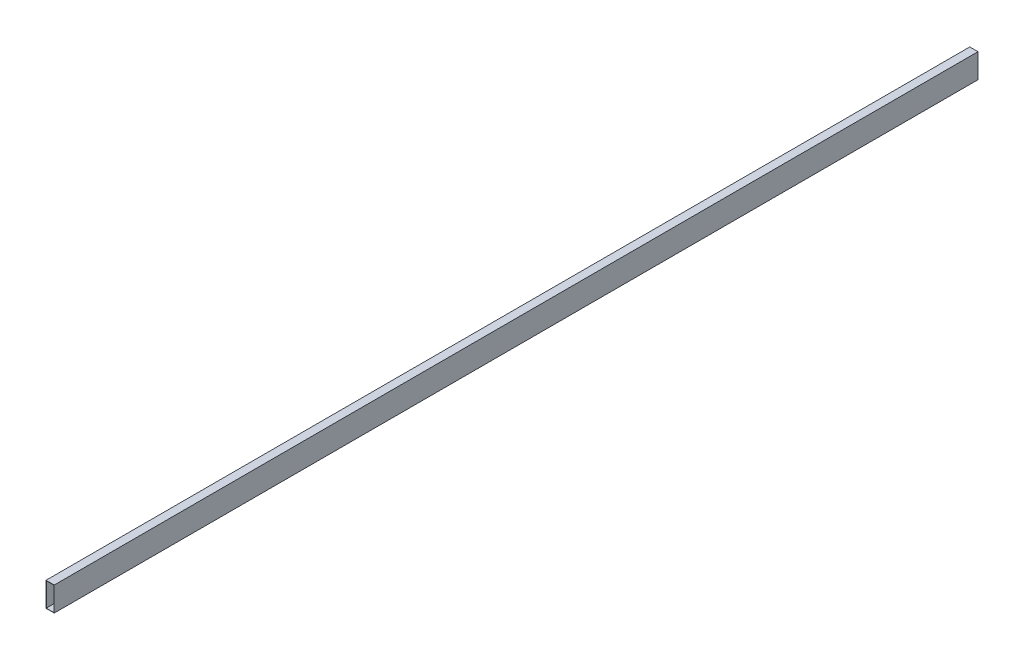
ISO-10303-21;
HEADER;
FILE_DESCRIPTION(('STEP AP214'),'2;1');
FILE_NAME('part.step','',(''),(''),'','','');
FILE_SCHEMA(('AUTOMOTIVE_DESIGN { 1 0 10303 214 1 1 1 1 }'));
ENDSEC;
DATA;
#1=APPLICATION_CONTEXT('core data for automotive mechanical design processes');
#2=APPLICATION_PROTOCOL_DEFINITION('international standard','automotive_design',2000,#1);
#3=PRODUCT_CONTEXT('',#1,'mechanical');
#4=PRODUCT('Part','Part','',(#3));
#5=PRODUCT_RELATED_PRODUCT_CATEGORY('part','',(#4));
#6=PRODUCT_DEFINITION_FORMATION('','',#4);
#7=PRODUCT_DEFINITION_CONTEXT('part definition',#1,'design');
#8=PRODUCT_DEFINITION('design','',#6,#7);
#9=PRODUCT_DEFINITION_SHAPE('','',#8);
#10=(LENGTH_UNIT() NAMED_UNIT(*) SI_UNIT(.MILLI.,.METRE.));
#11=(NAMED_UNIT(*) PLANE_ANGLE_UNIT() SI_UNIT($,.RADIAN.));
#12=(NAMED_UNIT(*) SI_UNIT($,.STERADIAN.) SOLID_ANGLE_UNIT());
#13=UNCERTAINTY_MEASURE_WITH_UNIT(LENGTH_MEASURE(1.E-05),#10,'distance_accuracy_value','');
#14=(GEOMETRIC_REPRESENTATION_CONTEXT(3) GLOBAL_UNCERTAINTY_ASSIGNED_CONTEXT((#13)) GLOBAL_UNIT_ASSIGNED_CONTEXT((#10,
#11,#12)) REPRESENTATION_CONTEXT('',''));
#15=CARTESIAN_POINT('',(0.,0.,0.));
#16=DIRECTION('',(0.,0.,1.));
#17=DIRECTION('',(1.,0.,0.));
#18=AXIS2_PLACEMENT_3D('',#15,#16,#17);
#19=CARTESIAN_POINT('',(0.,0.,1524.));
#20=DIRECTION('',(0.,0.,1.));
#21=DIRECTION('',(1.,0.,0.));
#22=AXIS2_PLACEMENT_3D('',#19,#20,#21);
#23=PLANE('',#22);
#24=DIRECTION('',(-1.,1.30720203061347E-13,0.));
#25=VECTOR('',#24,1.);
#26=CARTESIAN_POINT('',(6542.11347787889,4657.28704071688,1524.));
#27=LINE('',#26,#25);
#28=CARTESIAN_POINT('',(6542.11347787889,4657.28704071688,1524.));
#29=VERTEX_POINT('',#28);
#30=CARTESIAN_POINT('',(6528.5244778789,4657.28704071688,1524.));
#31=VERTEX_POINT('',#30);
#32=EDGE_CURVE('E136',#29,#31,#27,.T.);
#33=ORIENTED_EDGE('',*,*,#32,.T.);
#34=DIRECTION('',(-1.32878729832926E-13,-1.,0.));
#35=VECTOR('',#34,1.);
#36=CARTESIAN_POINT('',(6528.5244778789,4657.28704071688,1524.));
#37=LINE('',#36,#35);
#38=CARTESIAN_POINT('',(6528.52447787889,4617.18227357393,1524.));
#39=VERTEX_POINT('',#38);
#40=EDGE_CURVE('E139',#31,#39,#37,.T.);
#41=ORIENTED_EDGE('',*,*,#40,.T.);
#42=DIRECTION('',(1.,0.,0.));
#43=VECTOR('',#42,1.);
#44=CARTESIAN_POINT('',(6542.11347787889,4617.18227357393,1524.));
#45=LINE('',#44,#43);
#46=CARTESIAN_POINT('',(6542.11347787889,4617.18227357393,1524.));
#47=VERTEX_POINT('',#46);
#48=EDGE_CURVE('E142',#39,#47,#45,.T.);
#49=ORIENTED_EDGE('',*,*,#48,.T.);
#50=DIRECTION('',(0.,1.,0.));
#51=VECTOR('',#50,1.);
#52=CARTESIAN_POINT('',(6542.11347787889,4657.28704071688,1524.));
#53=LINE('',#52,#51);
#54=EDGE_CURVE('E144',#47,#29,#53,.T.);
#55=ORIENTED_EDGE('',*,*,#54,.T.);
#56=EDGE_LOOP('',(#33,#41,#49,#55));
#57=FACE_BOUND('',#56,.T.);
#58=DIRECTION('',(0.,-1.,0.));
#59=VECTOR('',#58,1.);
#60=CARTESIAN_POINT('',(6528.96897787889,4656.84254071688,1524.));
#61=LINE('',#60,#59);
#62=CARTESIAN_POINT('',(6528.96897787889,4656.84254071688,1524.));
#63=VERTEX_POINT('',#62);
#64=CARTESIAN_POINT('',(6528.96897787889,4617.62677357393,1524.));
#65=VERTEX_POINT('',#64);
#66=EDGE_CURVE('E108',#63,#65,#61,.T.);
#67=ORIENTED_EDGE('',*,*,#66,.F.);
#68=DIRECTION('',(-1.,0.,0.));
#69=VECTOR('',#68,1.);
#70=CARTESIAN_POINT('',(6541.66897787889,4656.84254071688,1524.));
#71=LINE('',#70,#69);
#72=CARTESIAN_POINT('',(6541.66897787889,4656.84254071688,1524.));
#73=VERTEX_POINT('',#72);
#74=EDGE_CURVE('E100',#73,#63,#71,.T.);
#75=ORIENTED_EDGE('',*,*,#74,.F.);
#76=DIRECTION('',(0.,1.,0.));
#77=VECTOR('',#76,1.);
#78=CARTESIAN_POINT('',(6541.66897787889,4656.84254071688,1524.));
#79=LINE('',#78,#77);
#80=CARTESIAN_POINT('',(6541.66897787889,4617.62677357393,1524.));
#81=VERTEX_POINT('',#80);
#82=EDGE_CURVE('E122',#81,#73,#79,.T.);
#83=ORIENTED_EDGE('',*,*,#82,.F.);
#84=DIRECTION('',(1.,0.,0.));
#85=VECTOR('',#84,1.);
#86=CARTESIAN_POINT('',(6541.66897787889,4617.62677357393,1524.));
#87=LINE('',#86,#85);
#88=EDGE_CURVE('E120',#65,#81,#87,.T.);
#89=ORIENTED_EDGE('',*,*,#88,.F.);
#90=EDGE_LOOP('',(#67,#75,#83,#89));
#91=FACE_BOUND('',#90,.T.);
#92=ADVANCED_FACE('F35',(#57,#91),#23,.T.);
#93=CARTESIAN_POINT('',(0.,0.,0.));
#94=DIRECTION('',(0.,0.,1.));
#95=DIRECTION('',(1.,0.,0.));
#96=AXIS2_PLACEMENT_3D('',#93,#94,#95);
#97=PLANE('',#96);
#98=DIRECTION('',(-1.,1.30720203061347E-13,0.));
#99=VECTOR('',#98,1.);
#100=CARTESIAN_POINT('',(6542.11347787889,4657.28704071688,0.));
#101=LINE('',#100,#99);
#102=CARTESIAN_POINT('',(6542.11347787889,4657.28704071688,0.));
#103=VERTEX_POINT('',#102);
#104=CARTESIAN_POINT('',(6528.5244778789,4657.28704071688,0.));
#105=VERTEX_POINT('',#104);
#106=EDGE_CURVE('E116',#103,#105,#101,.T.);
#107=ORIENTED_EDGE('',*,*,#106,.F.);
#108=DIRECTION('',(0.,1.,0.));
#109=VECTOR('',#108,1.);
#110=CARTESIAN_POINT('',(6542.11347787889,4657.28704071688,0.));
#111=LINE('',#110,#109);
#112=CARTESIAN_POINT('',(6542.11347787889,4617.18227357393,0.));
#113=VERTEX_POINT('',#112);
#114=EDGE_CURVE('E140',#113,#103,#111,.T.);
#115=ORIENTED_EDGE('',*,*,#114,.F.);
#116=DIRECTION('',(1.,0.,0.));
#117=VECTOR('',#116,1.);
#118=CARTESIAN_POINT('',(6542.11347787889,4617.18227357393,0.));
#119=LINE('',#118,#117);
#120=CARTESIAN_POINT('',(6528.52447787889,4617.18227357393,0.));
#121=VERTEX_POINT('',#120);
#122=EDGE_CURVE('E151',#121,#113,#119,.T.);
#123=ORIENTED_EDGE('',*,*,#122,.F.);
#124=DIRECTION('',(-1.32878729832926E-13,-1.,0.));
#125=VECTOR('',#124,1.);
#126=CARTESIAN_POINT('',(6528.5244778789,4657.28704071688,0.));
#127=LINE('',#126,#125);
#128=EDGE_CURVE('E149',#105,#121,#127,.T.);
#129=ORIENTED_EDGE('',*,*,#128,.F.);
#130=EDGE_LOOP('',(#107,#115,#123,#129));
#131=FACE_BOUND('',#130,.T.);
#132=DIRECTION('',(-1.,0.,0.));
#133=VECTOR('',#132,1.);
#134=CARTESIAN_POINT('',(6541.66897787889,4656.84254071688,0.));
#135=LINE('',#134,#133);
#136=CARTESIAN_POINT('',(6541.66897787889,4656.84254071688,0.));
#137=VERTEX_POINT('',#136);
#138=CARTESIAN_POINT('',(6528.96897787889,4656.84254071688,0.));
#139=VERTEX_POINT('',#138);
#140=EDGE_CURVE('E58',#137,#139,#135,.T.);
#141=ORIENTED_EDGE('',*,*,#140,.T.);
#142=DIRECTION('',(0.,-1.,0.));
#143=VECTOR('',#142,1.);
#144=CARTESIAN_POINT('',(6528.96897787889,4656.84254071688,0.));
#145=LINE('',#144,#143);
#146=CARTESIAN_POINT('',(6528.96897787889,4617.62677357393,0.));
#147=VERTEX_POINT('',#146);
#148=EDGE_CURVE('E115',#139,#147,#145,.T.);
#149=ORIENTED_EDGE('',*,*,#148,.T.);
#150=DIRECTION('',(1.,0.,0.));
#151=VECTOR('',#150,1.);
#152=CARTESIAN_POINT('',(6541.66897787889,4617.62677357393,0.));
#153=LINE('',#152,#151);
#154=CARTESIAN_POINT('',(6541.66897787889,4617.62677357393,0.));
#155=VERTEX_POINT('',#154);
#156=EDGE_CURVE('E128',#147,#155,#153,.T.);
#157=ORIENTED_EDGE('',*,*,#156,.T.);
#158=DIRECTION('',(0.,1.,0.));
#159=VECTOR('',#158,1.);
#160=CARTESIAN_POINT('',(6541.66897787889,4656.84254071688,0.));
#161=LINE('',#160,#159);
#162=EDGE_CURVE('E109',#155,#137,#161,.T.);
#163=ORIENTED_EDGE('',*,*,#162,.T.);
#164=EDGE_LOOP('',(#141,#149,#157,#163));
#165=FACE_BOUND('',#164,.T.);
#166=ADVANCED_FACE('F169',(#131,#165),#97,.F.);
#167=CARTESIAN_POINT('',(6542.11347787889,4657.28704071688,1524.));
#168=DIRECTION('',(-1.30720203061347E-13,-1.,0.));
#169=DIRECTION('',(1.,-1.30720203061347E-13,0.));
#170=AXIS2_PLACEMENT_3D('',#167,#168,#169);
#171=PLANE('',#170);
#172=ORIENTED_EDGE('',*,*,#106,.T.);
#173=DIRECTION('',(0.,0.,-1.));
#174=VECTOR('',#173,1.);
#175=CARTESIAN_POINT('',(6528.5244778789,4657.28704071688,1524.));
#176=LINE('',#175,#174);
#177=EDGE_CURVE('E11',#31,#105,#176,.T.);
#178=ORIENTED_EDGE('',*,*,#177,.F.);
#179=ORIENTED_EDGE('',*,*,#32,.F.);
#180=DIRECTION('',(0.,0.,-1.));
#181=VECTOR('',#180,1.);
#182=CARTESIAN_POINT('',(6542.11347787889,4657.28704071688,1524.));
#183=LINE('',#182,#181);
#184=EDGE_CURVE('E146',#29,#103,#183,.T.);
#185=ORIENTED_EDGE('',*,*,#184,.T.);
#186=EDGE_LOOP('',(#172,#178,#179,#185));
#187=FACE_BOUND('',#186,.T.);
#188=ADVANCED_FACE('F37',(#187),#171,.F.);
#189=CARTESIAN_POINT('',(6528.5244778789,4657.28704071688,1524.));
#190=DIRECTION('',(1.,-1.32878729832926E-13,0.));
#191=DIRECTION('',(1.32878729832926E-13,1.,0.));
#192=AXIS2_PLACEMENT_3D('',#189,#190,#191);
#193=PLANE('',#192);
#194=ORIENTED_EDGE('',*,*,#128,.T.);
#195=DIRECTION('',(0.,0.,-1.));
#196=VECTOR('',#195,1.);
#197=CARTESIAN_POINT('',(6528.52447787889,4617.18227357393,1524.));
#198=LINE('',#197,#196);
#199=EDGE_CURVE('E43',#39,#121,#198,.T.);
#200=ORIENTED_EDGE('',*,*,#199,.F.);
#201=ORIENTED_EDGE('',*,*,#40,.F.);
#202=ORIENTED_EDGE('',*,*,#177,.T.);
#203=EDGE_LOOP('',(#194,#200,#201,#202));
#204=FACE_BOUND('',#203,.T.);
#205=ADVANCED_FACE('F179',(#204),#193,.F.);
#206=CARTESIAN_POINT('',(6542.11347787889,4617.18227357393,1524.));
#207=DIRECTION('',(0.,1.,0.));
#208=DIRECTION('',(0.,0.,1.));
#209=AXIS2_PLACEMENT_3D('',#206,#207,#208);
#210=PLANE('',#209);
#211=ORIENTED_EDGE('',*,*,#122,.T.);
#212=DIRECTION('',(0.,0.,-1.));
#213=VECTOR('',#212,1.);
#214=CARTESIAN_POINT('',(6542.11347787889,4617.18227357393,1524.));
#215=LINE('',#214,#213);
#216=EDGE_CURVE('E156',#47,#113,#215,.T.);
#217=ORIENTED_EDGE('',*,*,#216,.F.);
#218=ORIENTED_EDGE('',*,*,#48,.F.);
#219=ORIENTED_EDGE('',*,*,#199,.T.);
#220=EDGE_LOOP('',(#211,#217,#218,#219));
#221=FACE_BOUND('',#220,.T.);
#222=ADVANCED_FACE('F163',(#221),#210,.F.);
#223=CARTESIAN_POINT('',(6542.11347787889,4657.28704071688,1524.));
#224=DIRECTION('',(-1.,0.,0.));
#225=DIRECTION('',(0.,0.,1.));
#226=AXIS2_PLACEMENT_3D('',#223,#224,#225);
#227=PLANE('',#226);
#228=ORIENTED_EDGE('',*,*,#114,.T.);
#229=ORIENTED_EDGE('',*,*,#184,.F.);
#230=ORIENTED_EDGE('',*,*,#54,.F.);
#231=ORIENTED_EDGE('',*,*,#216,.T.);
#232=EDGE_LOOP('',(#228,#229,#230,#231));
#233=FACE_BOUND('',#232,.T.);
#234=ADVANCED_FACE('F173',(#233),#227,.F.);
#235=CARTESIAN_POINT('',(6541.66897787889,4656.84254071688,1524.));
#236=DIRECTION('',(0.,-1.,0.));
#237=DIRECTION('',(0.,0.,-1.));
#238=AXIS2_PLACEMENT_3D('',#235,#236,#237);
#239=PLANE('',#238);
#240=ORIENTED_EDGE('',*,*,#140,.F.);
#241=DIRECTION('',(0.,0.,-1.));
#242=VECTOR('',#241,1.);
#243=CARTESIAN_POINT('',(6541.66897787889,4656.84254071688,1524.));
#244=LINE('',#243,#242);
#245=EDGE_CURVE('E104',#73,#137,#244,.T.);
#246=ORIENTED_EDGE('',*,*,#245,.F.);
#247=ORIENTED_EDGE('',*,*,#74,.T.);
#248=DIRECTION('',(0.,0.,-1.));
#249=VECTOR('',#248,1.);
#250=CARTESIAN_POINT('',(6528.96897787889,4656.84254071688,1524.));
#251=LINE('',#250,#249);
#252=EDGE_CURVE('E103',#63,#139,#251,.T.);
#253=ORIENTED_EDGE('',*,*,#252,.T.);
#254=EDGE_LOOP('',(#240,#246,#247,#253));
#255=FACE_BOUND('',#254,.T.);
#256=ADVANCED_FACE('F102',(#255),#239,.T.);
#257=CARTESIAN_POINT('',(6528.96897787889,4656.84254071688,1524.));
#258=DIRECTION('',(1.,0.,0.));
#259=DIRECTION('',(0.,1.,0.));
#260=AXIS2_PLACEMENT_3D('',#257,#258,#259);
#261=PLANE('',#260);
#262=ORIENTED_EDGE('',*,*,#148,.F.);
#263=ORIENTED_EDGE('',*,*,#252,.F.);
#264=ORIENTED_EDGE('',*,*,#66,.T.);
#265=DIRECTION('',(0.,0.,-1.));
#266=VECTOR('',#265,1.);
#267=CARTESIAN_POINT('',(6528.96897787889,4617.62677357393,1524.));
#268=LINE('',#267,#266);
#269=EDGE_CURVE('E117',#65,#147,#268,.T.);
#270=ORIENTED_EDGE('',*,*,#269,.T.);
#271=EDGE_LOOP('',(#262,#263,#264,#270));
#272=FACE_BOUND('',#271,.T.);
#273=ADVANCED_FACE('F112',(#272),#261,.T.);
#274=CARTESIAN_POINT('',(6541.66897787889,4617.62677357393,1524.));
#275=DIRECTION('',(0.,1.,0.));
#276=DIRECTION('',(0.,0.,1.));
#277=AXIS2_PLACEMENT_3D('',#274,#275,#276);
#278=PLANE('',#277);
#279=ORIENTED_EDGE('',*,*,#156,.F.);
#280=ORIENTED_EDGE('',*,*,#269,.F.);
#281=ORIENTED_EDGE('',*,*,#88,.T.);
#282=DIRECTION('',(0.,0.,-1.));
#283=VECTOR('',#282,1.);
#284=CARTESIAN_POINT('',(6541.66897787889,4617.62677357393,1524.));
#285=LINE('',#284,#283);
#286=EDGE_CURVE('E50',#81,#155,#285,.T.);
#287=ORIENTED_EDGE('',*,*,#286,.T.);
#288=EDGE_LOOP('',(#279,#280,#281,#287));
#289=FACE_BOUND('',#288,.T.);
#290=ADVANCED_FACE('F202',(#289),#278,.T.);
#291=CARTESIAN_POINT('',(6541.66897787889,4656.84254071688,1524.));
#292=DIRECTION('',(-1.,0.,0.));
#293=DIRECTION('',(0.,-1.,0.));
#294=AXIS2_PLACEMENT_3D('',#291,#292,#293);
#295=PLANE('',#294);
#296=ORIENTED_EDGE('',*,*,#162,.F.);
#297=ORIENTED_EDGE('',*,*,#286,.F.);
#298=ORIENTED_EDGE('',*,*,#82,.T.);
#299=ORIENTED_EDGE('',*,*,#245,.T.);
#300=EDGE_LOOP('',(#296,#297,#298,#299));
#301=FACE_BOUND('',#300,.T.);
#302=ADVANCED_FACE('F206',(#301),#295,.T.);
#303=CLOSED_SHELL('',(#92,#166,#188,#205,#222,#234,#256,#273,#290,#302));
#304=MANIFOLD_SOLID_BREP('B2',#303);
#305=ADVANCED_BREP_SHAPE_REPRESENTATION('',(#18,#304),#14);
#306=SHAPE_DEFINITION_REPRESENTATION(#9,#305);
ENDSEC;
END-ISO-10303-21;
